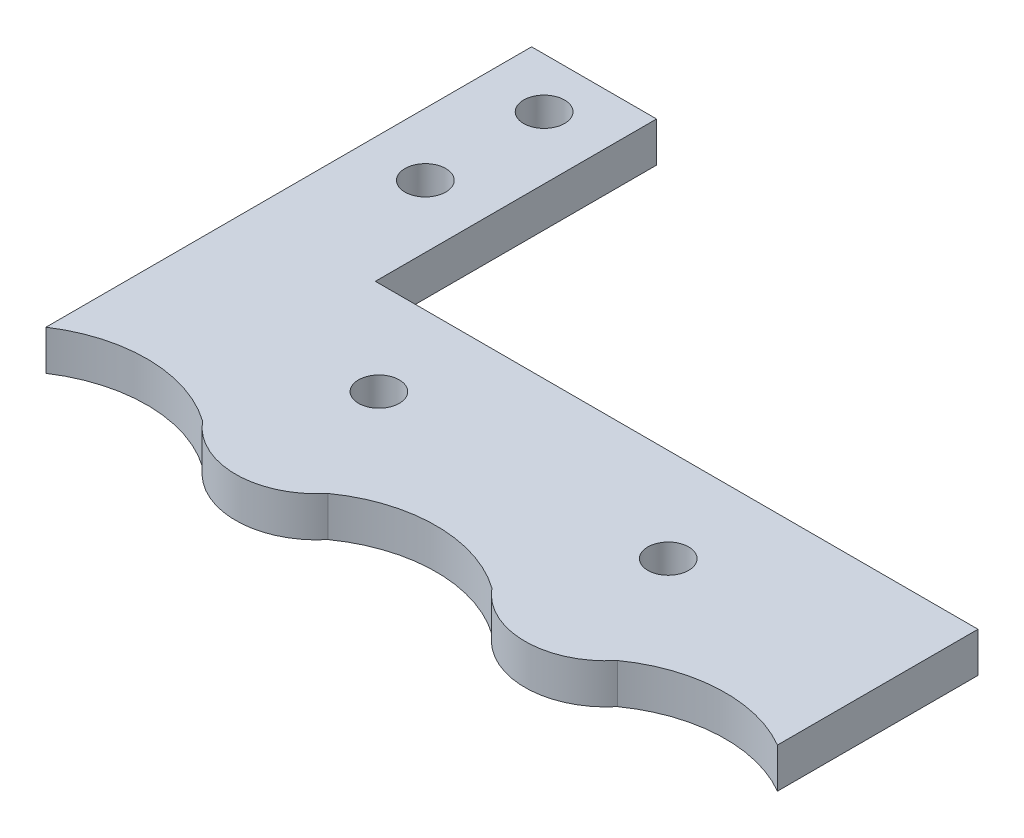
ISO-10303-21;
HEADER;
FILE_DESCRIPTION(('STEP AP214'),'2;1');
FILE_NAME('part.step','',(''),(''),'','','');
FILE_SCHEMA(('AUTOMOTIVE_DESIGN { 1 0 10303 214 1 1 1 1 }'));
ENDSEC;
DATA;
#1=APPLICATION_CONTEXT('core data for automotive mechanical design processes');
#2=APPLICATION_PROTOCOL_DEFINITION('international standard','automotive_design',2000,#1);
#3=PRODUCT_CONTEXT('',#1,'mechanical');
#4=PRODUCT('Part','Part','',(#3));
#5=PRODUCT_RELATED_PRODUCT_CATEGORY('part','',(#4));
#6=PRODUCT_DEFINITION_FORMATION('','',#4);
#7=PRODUCT_DEFINITION_CONTEXT('part definition',#1,'design');
#8=PRODUCT_DEFINITION('design','',#6,#7);
#9=PRODUCT_DEFINITION_SHAPE('','',#8);
#10=(LENGTH_UNIT() NAMED_UNIT(*) SI_UNIT(.MILLI.,.METRE.));
#11=(NAMED_UNIT(*) PLANE_ANGLE_UNIT() SI_UNIT($,.RADIAN.));
#12=(NAMED_UNIT(*) SI_UNIT($,.STERADIAN.) SOLID_ANGLE_UNIT());
#13=UNCERTAINTY_MEASURE_WITH_UNIT(LENGTH_MEASURE(1.E-05),#10,'distance_accuracy_value','');
#14=(GEOMETRIC_REPRESENTATION_CONTEXT(3) GLOBAL_UNCERTAINTY_ASSIGNED_CONTEXT((#13)) GLOBAL_UNIT_ASSIGNED_CONTEXT((#10,
#11,#12)) REPRESENTATION_CONTEXT('',''));
#15=CARTESIAN_POINT('',(0.,0.,0.));
#16=DIRECTION('',(0.,0.,1.));
#17=DIRECTION('',(1.,0.,0.));
#18=AXIS2_PLACEMENT_3D('',#15,#16,#17);
#19=CARTESIAN_POINT('',(-23.15,0.,0.));
#20=DIRECTION('',(0.,-1.,0.));
#21=DIRECTION('',(0.,0.,-1.));
#22=AXIS2_PLACEMENT_3D('',#19,#20,#21);
#23=PLANE('',#22);
#24=CARTESIAN_POINT('',(11.575,0.,-18.325));
#25=DIRECTION('',(0.,-1.,0.));
#26=DIRECTION('',(0.,0.,-1.));
#27=AXIS2_PLACEMENT_3D('',#24,#25,#26);
#28=CIRCLE('',#27,1.63195);
#29=CARTESIAN_POINT('',(11.575,0.,-19.95695));
#30=VERTEX_POINT('',#29);
#31=EDGE_CURVE('E181',#30,#30,#28,.F.);
#32=ORIENTED_EDGE('',*,*,#31,.F.);
#33=EDGE_LOOP('',(#32));
#34=FACE_BOUND('',#33,.T.);
#35=CARTESIAN_POINT('',(-24.3589649235001,0.,-44.325));
#36=DIRECTION('',(0.,1.,0.));
#37=DIRECTION('',(0.,0.,1.));
#38=AXIS2_PLACEMENT_3D('',#35,#36,#37);
#39=CIRCLE('',#38,1.635);
#40=CARTESIAN_POINT('',(-24.3589649235001,0.,-42.69));
#41=VERTEX_POINT('',#40);
#42=EDGE_CURVE('E187',#41,#41,#39,.T.);
#43=ORIENTED_EDGE('',*,*,#42,.F.);
#44=EDGE_LOOP('',(#43));
#45=FACE_BOUND('',#44,.T.);
#46=CARTESIAN_POINT('',(-24.3589649235001,0.,-34.825));
#47=DIRECTION('',(0.,1.,0.));
#48=DIRECTION('',(0.,0.,1.));
#49=AXIS2_PLACEMENT_3D('',#46,#47,#48);
#50=CIRCLE('',#49,1.635);
#51=CARTESIAN_POINT('',(-24.3589649235001,0.,-33.19));
#52=VERTEX_POINT('',#51);
#53=EDGE_CURVE('E191',#52,#52,#50,.T.);
#54=ORIENTED_EDGE('',*,*,#53,.F.);
#55=EDGE_LOOP('',(#54));
#56=FACE_BOUND('',#55,.T.);
#57=CARTESIAN_POINT('',(23.15,0.,0.));
#58=DIRECTION('',(0.,-1.,0.));
#59=DIRECTION('',(0.,0.,-1.));
#60=AXIS2_PLACEMENT_3D('',#57,#58,#59);
#61=CIRCLE('',#60,11.325);
#62=CARTESIAN_POINT('',(28.8589649235001,0.,-9.78076400401553));
#63=VERTEX_POINT('',#62);
#64=CARTESIAN_POINT('',(16.5986509739885,0.,-9.23771892511231));
#65=VERTEX_POINT('',#64);
#66=EDGE_CURVE('E230',#63,#65,#61,.F.);
#67=ORIENTED_EDGE('',*,*,#66,.F.);
#68=DIRECTION('',(0.,0.,1.));
#69=VECTOR('',#68,1.);
#70=CARTESIAN_POINT('',(28.8589649235001,0.,-9.78076400401553));
#71=LINE('',#70,#69);
#72=CARTESIAN_POINT('',(28.8589649235001,0.,-25.825));
#73=VERTEX_POINT('',#72);
#74=EDGE_CURVE('E154',#73,#63,#71,.T.);
#75=ORIENTED_EDGE('',*,*,#74,.F.);
#76=DIRECTION('',(-1.,0.,0.));
#77=VECTOR('',#76,1.);
#78=CARTESIAN_POINT('',(-19.3589649235001,0.,-25.825));
#79=LINE('',#78,#77);
#80=CARTESIAN_POINT('',(-19.3589649235001,0.,-25.825));
#81=VERTEX_POINT('',#80);
#82=EDGE_CURVE('E194',#73,#81,#79,.T.);
#83=ORIENTED_EDGE('',*,*,#82,.T.);
#84=DIRECTION('',(0.,0.,-1.));
#85=VECTOR('',#84,1.);
#86=CARTESIAN_POINT('',(-19.3589649235001,0.,-48.325));
#87=LINE('',#86,#85);
#88=CARTESIAN_POINT('',(-19.3589649235001,0.,-48.325));
#89=VERTEX_POINT('',#88);
#90=EDGE_CURVE('E210',#81,#89,#87,.T.);
#91=ORIENTED_EDGE('',*,*,#90,.T.);
#92=DIRECTION('',(-1.,0.,0.));
#93=VECTOR('',#92,1.);
#94=CARTESIAN_POINT('',(-29.3589649235001,0.,-48.325));
#95=LINE('',#94,#93);
#96=CARTESIAN_POINT('',(-29.3589649235001,0.,-48.325));
#97=VERTEX_POINT('',#96);
#98=EDGE_CURVE('E213',#89,#97,#95,.T.);
#99=ORIENTED_EDGE('',*,*,#98,.T.);
#100=DIRECTION('',(0.,0.,1.));
#101=VECTOR('',#100,1.);
#102=CARTESIAN_POINT('',(-29.3589649235001,0.,-8.86732087942835));
#103=LINE('',#102,#101);
#104=CARTESIAN_POINT('',(-29.3589649235001,0.,-9.47123960095752));
#105=VERTEX_POINT('',#104);
#106=EDGE_CURVE('E82',#97,#105,#103,.T.);
#107=ORIENTED_EDGE('',*,*,#106,.T.);
#108=CARTESIAN_POINT('',(-23.15,0.,0.));
#109=DIRECTION('',(0.,-1.,0.));
#110=DIRECTION('',(0.,0.,-1.));
#111=AXIS2_PLACEMENT_3D('',#108,#109,#110);
#112=CIRCLE('',#111,11.325);
#113=CARTESIAN_POINT('',(-16.5986509739885,0.,-9.23771892511232));
#114=VERTEX_POINT('',#113);
#115=EDGE_CURVE('E165',#114,#105,#112,.F.);
#116=ORIENTED_EDGE('',*,*,#115,.F.);
#117=CARTESIAN_POINT('',(-11.575,0.,-13.3623923535845));
#118=DIRECTION('',(0.,-1.,0.));
#119=DIRECTION('',(0.,0.,-1.));
#120=AXIS2_PLACEMENT_3D('',#117,#118,#119);
#121=CIRCLE('',#120,6.5);
#122=CARTESIAN_POINT('',(-6.5513490260115,0.,-9.23771892511231));
#123=VERTEX_POINT('',#122);
#124=EDGE_CURVE('E140',#123,#114,#121,.T.);
#125=ORIENTED_EDGE('',*,*,#124,.F.);
#126=CARTESIAN_POINT('',(0.,0.,0.));
#127=DIRECTION('',(0.,-1.,0.));
#128=DIRECTION('',(0.,0.,-1.));
#129=AXIS2_PLACEMENT_3D('',#126,#127,#128);
#130=CIRCLE('',#129,11.325);
#131=CARTESIAN_POINT('',(6.55134902601148,0.,-9.23771892511233));
#132=VERTEX_POINT('',#131);
#133=EDGE_CURVE('E236',#132,#123,#130,.F.);
#134=ORIENTED_EDGE('',*,*,#133,.F.);
#135=CARTESIAN_POINT('',(11.575,0.,-13.3623923535845));
#136=DIRECTION('',(0.,-1.,0.));
#137=DIRECTION('',(0.,0.,-1.));
#138=AXIS2_PLACEMENT_3D('',#135,#136,#137);
#139=CIRCLE('',#138,6.5);
#140=EDGE_CURVE('E233',#65,#132,#139,.T.);
#141=ORIENTED_EDGE('',*,*,#140,.F.);
#142=EDGE_LOOP('',(#67,#75,#83,#91,#99,#107,#116,#125,#134,#141));
#143=FACE_BOUND('',#142,.T.);
#144=CARTESIAN_POINT('',(-11.575,0.,-18.325));
#145=DIRECTION('',(0.,-1.,0.));
#146=DIRECTION('',(0.,0.,-1.));
#147=AXIS2_PLACEMENT_3D('',#144,#145,#146);
#148=CIRCLE('',#147,1.63195);
#149=CARTESIAN_POINT('',(-11.575,0.,-19.95695));
#150=VERTEX_POINT('',#149);
#151=EDGE_CURVE('E175',#150,#150,#148,.F.);
#152=ORIENTED_EDGE('',*,*,#151,.F.);
#153=EDGE_LOOP('',(#152));
#154=FACE_BOUND('',#153,.T.);
#155=ADVANCED_FACE('F45',(#34,#45,#56,#143,#154),#23,.F.);
#156=CARTESIAN_POINT('',(-29.3589649235001,-3.2,-8.86732087942835));
#157=DIRECTION('',(-1.,0.,0.));
#158=DIRECTION('',(0.,0.,1.));
#159=AXIS2_PLACEMENT_3D('',#156,#157,#158);
#160=PLANE('',#159);
#161=DIRECTION('',(0.,-1.,0.));
#162=VECTOR('',#161,1.);
#163=CARTESIAN_POINT('',(-29.3589649235001,66.7840576637726,-9.47123960095752));
#164=LINE('',#163,#162);
#165=CARTESIAN_POINT('',(-29.3589649235001,-3.19999999999999,-9.47123960095752));
#166=VERTEX_POINT('',#165);
#167=EDGE_CURVE('E59',#105,#166,#164,.T.);
#168=ORIENTED_EDGE('',*,*,#167,.F.);
#169=ORIENTED_EDGE('',*,*,#106,.F.);
#170=DIRECTION('',(0.,1.,0.));
#171=VECTOR('',#170,1.);
#172=CARTESIAN_POINT('',(-29.3589649235001,-3.2,-48.325));
#173=LINE('',#172,#171);
#174=CARTESIAN_POINT('',(-29.3589649235001,-3.2,-48.325));
#175=VERTEX_POINT('',#174);
#176=EDGE_CURVE('E53',#175,#97,#173,.T.);
#177=ORIENTED_EDGE('',*,*,#176,.F.);
#178=DIRECTION('',(0.,0.,1.));
#179=VECTOR('',#178,1.);
#180=CARTESIAN_POINT('',(-29.3589649235001,-3.2,-25.825));
#181=LINE('',#180,#179);
#182=EDGE_CURVE('E206',#175,#166,#181,.T.);
#183=ORIENTED_EDGE('',*,*,#182,.T.);
#184=EDGE_LOOP('',(#168,#169,#177,#183));
#185=FACE_BOUND('',#184,.T.);
#186=ADVANCED_FACE('F241',(#185),#160,.T.);
#187=CARTESIAN_POINT('',(-29.3589649235001,-3.2,-48.325));
#188=DIRECTION('',(0.,0.,-1.));
#189=DIRECTION('',(-1.,0.,0.));
#190=AXIS2_PLACEMENT_3D('',#187,#188,#189);
#191=PLANE('',#190);
#192=ORIENTED_EDGE('',*,*,#98,.F.);
#193=DIRECTION('',(0.,1.,0.));
#194=VECTOR('',#193,1.);
#195=CARTESIAN_POINT('',(-19.3589649235001,-3.2,-48.325));
#196=LINE('',#195,#194);
#197=CARTESIAN_POINT('',(-19.3589649235001,-3.2,-48.325));
#198=VERTEX_POINT('',#197);
#199=EDGE_CURVE('E218',#198,#89,#196,.T.);
#200=ORIENTED_EDGE('',*,*,#199,.F.);
#201=DIRECTION('',(-1.,0.,0.));
#202=VECTOR('',#201,1.);
#203=CARTESIAN_POINT('',(-29.3589649235001,-3.2,-48.325));
#204=LINE('',#203,#202);
#205=EDGE_CURVE('E203',#198,#175,#204,.T.);
#206=ORIENTED_EDGE('',*,*,#205,.T.);
#207=ORIENTED_EDGE('',*,*,#176,.T.);
#208=EDGE_LOOP('',(#192,#200,#206,#207));
#209=FACE_BOUND('',#208,.T.);
#210=ADVANCED_FACE('F244',(#209),#191,.T.);
#211=CARTESIAN_POINT('',(-19.3589649235001,-3.2,-48.325));
#212=DIRECTION('',(1.,0.,0.));
#213=DIRECTION('',(0.,0.,-1.));
#214=AXIS2_PLACEMENT_3D('',#211,#212,#213);
#215=PLANE('',#214);
#216=ORIENTED_EDGE('',*,*,#90,.F.);
#217=DIRECTION('',(0.,1.,0.));
#218=VECTOR('',#217,1.);
#219=CARTESIAN_POINT('',(-19.3589649235001,-3.2,-25.825));
#220=LINE('',#219,#218);
#221=CARTESIAN_POINT('',(-19.3589649235001,-3.2,-25.825));
#222=VERTEX_POINT('',#221);
#223=EDGE_CURVE('E208',#222,#81,#220,.T.);
#224=ORIENTED_EDGE('',*,*,#223,.F.);
#225=DIRECTION('',(0.,0.,-1.));
#226=VECTOR('',#225,1.);
#227=CARTESIAN_POINT('',(-19.3589649235001,-3.2,-48.325));
#228=LINE('',#227,#226);
#229=EDGE_CURVE('E200',#222,#198,#228,.T.);
#230=ORIENTED_EDGE('',*,*,#229,.T.);
#231=ORIENTED_EDGE('',*,*,#199,.T.);
#232=EDGE_LOOP('',(#216,#224,#230,#231));
#233=FACE_BOUND('',#232,.T.);
#234=ADVANCED_FACE('F223',(#233),#215,.T.);
#235=CARTESIAN_POINT('',(-19.3589649235001,-3.2,-25.825));
#236=DIRECTION('',(0.,0.,-1.));
#237=DIRECTION('',(-1.,0.,0.));
#238=AXIS2_PLACEMENT_3D('',#235,#236,#237);
#239=PLANE('',#238);
#240=DIRECTION('',(0.,-1.,0.));
#241=VECTOR('',#240,1.);
#242=CARTESIAN_POINT('',(28.8589649235001,66.7840576637726,-25.825));
#243=LINE('',#242,#241);
#244=CARTESIAN_POINT('',(28.8589649235001,-3.2,-25.825));
#245=VERTEX_POINT('',#244);
#246=EDGE_CURVE('E163',#73,#245,#243,.T.);
#247=ORIENTED_EDGE('',*,*,#246,.T.);
#248=DIRECTION('',(-1.,0.,0.));
#249=VECTOR('',#248,1.);
#250=CARTESIAN_POINT('',(-19.3589649235001,-3.2,-25.825));
#251=LINE('',#250,#249);
#252=EDGE_CURVE('E88',#245,#222,#251,.T.);
#253=ORIENTED_EDGE('',*,*,#252,.T.);
#254=ORIENTED_EDGE('',*,*,#223,.T.);
#255=ORIENTED_EDGE('',*,*,#82,.F.);
#256=EDGE_LOOP('',(#247,#253,#254,#255));
#257=FACE_BOUND('',#256,.T.);
#258=ADVANCED_FACE('F47',(#257),#239,.T.);
#259=CARTESIAN_POINT('',(-23.15,-3.2,0.));
#260=DIRECTION('',(0.,-1.,0.));
#261=DIRECTION('',(0.,0.,-1.));
#262=AXIS2_PLACEMENT_3D('',#259,#260,#261);
#263=PLANE('',#262);
#264=DIRECTION('',(0.,0.,-1.));
#265=VECTOR('',#264,1.);
#266=CARTESIAN_POINT('',(28.8589649235001,-3.2,-9.78076400401553));
#267=LINE('',#266,#265);
#268=CARTESIAN_POINT('',(28.8589649235001,-3.2,-9.78076400401553));
#269=VERTEX_POINT('',#268);
#270=EDGE_CURVE('E142',#269,#245,#267,.T.);
#271=ORIENTED_EDGE('',*,*,#270,.F.);
#272=CARTESIAN_POINT('',(23.15,-3.2,0.));
#273=DIRECTION('',(0.,-1.,0.));
#274=DIRECTION('',(0.,0.,-1.));
#275=AXIS2_PLACEMENT_3D('',#272,#273,#274);
#276=CIRCLE('',#275,11.325);
#277=CARTESIAN_POINT('',(16.5986509739885,-3.2,-9.23771892511231));
#278=VERTEX_POINT('',#277);
#279=EDGE_CURVE('E159',#278,#269,#276,.T.);
#280=ORIENTED_EDGE('',*,*,#279,.F.);
#281=CARTESIAN_POINT('',(11.575,-3.2,-13.3623923535845));
#282=DIRECTION('',(0.,1.,0.));
#283=DIRECTION('',(0.,0.,-1.));
#284=AXIS2_PLACEMENT_3D('',#281,#282,#283);
#285=CIRCLE('',#284,6.5);
#286=CARTESIAN_POINT('',(6.55134902601148,-3.2,-9.23771892511233));
#287=VERTEX_POINT('',#286);
#288=EDGE_CURVE('E151',#287,#278,#285,.T.);
#289=ORIENTED_EDGE('',*,*,#288,.F.);
#290=CARTESIAN_POINT('',(0.,-3.2,0.));
#291=DIRECTION('',(0.,-1.,0.));
#292=DIRECTION('',(0.,0.,-1.));
#293=AXIS2_PLACEMENT_3D('',#290,#291,#292);
#294=CIRCLE('',#293,11.325);
#295=CARTESIAN_POINT('',(-6.5513490260115,-3.2,-9.23771892511231));
#296=VERTEX_POINT('',#295);
#297=EDGE_CURVE('E149',#296,#287,#294,.T.);
#298=ORIENTED_EDGE('',*,*,#297,.F.);
#299=CARTESIAN_POINT('',(-11.575,-3.2,-13.3623923535845));
#300=DIRECTION('',(0.,1.,0.));
#301=DIRECTION('',(0.,0.,-1.));
#302=AXIS2_PLACEMENT_3D('',#299,#300,#301);
#303=CIRCLE('',#302,6.5);
#304=CARTESIAN_POINT('',(-16.5986509739885,-3.2,-9.23771892511232));
#305=VERTEX_POINT('',#304);
#306=EDGE_CURVE('E137',#305,#296,#303,.T.);
#307=ORIENTED_EDGE('',*,*,#306,.F.);
#308=CARTESIAN_POINT('',(-23.15,-3.19999999999999,0.));
#309=DIRECTION('',(0.,-1.,0.));
#310=DIRECTION('',(0.,0.,-1.));
#311=AXIS2_PLACEMENT_3D('',#308,#309,#310);
#312=CIRCLE('',#311,11.325);
#313=EDGE_CURVE('E11',#166,#305,#312,.T.);
#314=ORIENTED_EDGE('',*,*,#313,.F.);
#315=ORIENTED_EDGE('',*,*,#182,.F.);
#316=ORIENTED_EDGE('',*,*,#205,.F.);
#317=ORIENTED_EDGE('',*,*,#229,.F.);
#318=ORIENTED_EDGE('',*,*,#252,.F.);
#319=EDGE_LOOP('',(#271,#280,#289,#298,#307,#314,#315,#316,#317,#318));
#320=FACE_BOUND('',#319,.T.);
#321=CARTESIAN_POINT('',(-11.575,-3.2,-18.325));
#322=DIRECTION('',(0.,-1.,0.));
#323=DIRECTION('',(0.,0.,-1.));
#324=AXIS2_PLACEMENT_3D('',#321,#322,#323);
#325=CIRCLE('',#324,1.63195);
#326=CARTESIAN_POINT('',(-11.575,-3.2,-19.95695));
#327=VERTEX_POINT('',#326);
#328=EDGE_CURVE('E174',#327,#327,#325,.T.);
#329=ORIENTED_EDGE('',*,*,#328,.F.);
#330=EDGE_LOOP('',(#329));
#331=FACE_BOUND('',#330,.T.);
#332=CARTESIAN_POINT('',(11.575,-3.2,-18.325));
#333=DIRECTION('',(0.,-1.,0.));
#334=DIRECTION('',(0.,0.,-1.));
#335=AXIS2_PLACEMENT_3D('',#332,#333,#334);
#336=CIRCLE('',#335,1.63195);
#337=CARTESIAN_POINT('',(11.575,-3.2,-19.95695));
#338=VERTEX_POINT('',#337);
#339=EDGE_CURVE('E178',#338,#338,#336,.T.);
#340=ORIENTED_EDGE('',*,*,#339,.F.);
#341=EDGE_LOOP('',(#340));
#342=FACE_BOUND('',#341,.T.);
#343=CARTESIAN_POINT('',(-24.3589649235001,-3.2,-44.325));
#344=DIRECTION('',(0.,-1.,0.));
#345=DIRECTION('',(0.,0.,-1.));
#346=AXIS2_PLACEMENT_3D('',#343,#344,#345);
#347=CIRCLE('',#346,1.635);
#348=CARTESIAN_POINT('',(-24.3589649235001,-3.2,-45.96));
#349=VERTEX_POINT('',#348);
#350=EDGE_CURVE('E190',#349,#349,#347,.F.);
#351=ORIENTED_EDGE('',*,*,#350,.T.);
#352=EDGE_LOOP('',(#351));
#353=FACE_BOUND('',#352,.T.);
#354=CARTESIAN_POINT('',(-24.3589649235001,-3.2,-34.825));
#355=DIRECTION('',(0.,-1.,0.));
#356=DIRECTION('',(0.,0.,-1.));
#357=AXIS2_PLACEMENT_3D('',#354,#355,#356);
#358=CIRCLE('',#357,1.635);
#359=CARTESIAN_POINT('',(-24.3589649235001,-3.2,-36.46));
#360=VERTEX_POINT('',#359);
#361=EDGE_CURVE('E184',#360,#360,#358,.F.);
#362=ORIENTED_EDGE('',*,*,#361,.T.);
#363=EDGE_LOOP('',(#362));
#364=FACE_BOUND('',#363,.T.);
#365=ADVANCED_FACE('F145',(#320,#331,#342,#353,#364),#263,.T.);
#366=CARTESIAN_POINT('',(-24.3589649235001,-7.82447834896003,-34.825));
#367=DIRECTION('',(0.,1.,0.));
#368=DIRECTION('',(0.,0.,1.));
#369=AXIS2_PLACEMENT_3D('',#366,#367,#368);
#370=CYLINDRICAL_SURFACE('',#369,1.635);
#371=ORIENTED_EDGE('',*,*,#53,.T.);
#372=EDGE_LOOP('',(#371));
#373=FACE_BOUND('',#372,.T.);
#374=ORIENTED_EDGE('',*,*,#361,.F.);
#375=EDGE_LOOP('',(#374));
#376=FACE_BOUND('',#375,.T.);
#377=ADVANCED_FACE('F263',(#373,#376),#370,.F.);
#378=CARTESIAN_POINT('',(-24.3589649235001,-7.82447834896003,-44.325));
#379=DIRECTION('',(0.,1.,0.));
#380=DIRECTION('',(0.,0.,1.));
#381=AXIS2_PLACEMENT_3D('',#378,#379,#380);
#382=CYLINDRICAL_SURFACE('',#381,1.635);
#383=ORIENTED_EDGE('',*,*,#42,.T.);
#384=EDGE_LOOP('',(#383));
#385=FACE_BOUND('',#384,.T.);
#386=ORIENTED_EDGE('',*,*,#350,.F.);
#387=EDGE_LOOP('',(#386));
#388=FACE_BOUND('',#387,.T.);
#389=ADVANCED_FACE('F266',(#385,#388),#382,.F.);
#390=CARTESIAN_POINT('',(11.575,-3.2,-18.325));
#391=DIRECTION('',(0.,-1.,0.));
#392=DIRECTION('',(0.,0.,-1.));
#393=AXIS2_PLACEMENT_3D('',#390,#391,#392);
#394=CYLINDRICAL_SURFACE('',#393,1.63195);
#395=ORIENTED_EDGE('',*,*,#31,.T.);
#396=EDGE_LOOP('',(#395));
#397=FACE_BOUND('',#396,.T.);
#398=ORIENTED_EDGE('',*,*,#339,.T.);
#399=EDGE_LOOP('',(#398));
#400=FACE_BOUND('',#399,.T.);
#401=ADVANCED_FACE('F270',(#397,#400),#394,.F.);
#402=CARTESIAN_POINT('',(-11.575,-3.2,-18.325));
#403=DIRECTION('',(0.,-1.,0.));
#404=DIRECTION('',(0.,0.,-1.));
#405=AXIS2_PLACEMENT_3D('',#402,#403,#404);
#406=CYLINDRICAL_SURFACE('',#405,1.63195);
#407=ORIENTED_EDGE('',*,*,#151,.T.);
#408=EDGE_LOOP('',(#407));
#409=FACE_BOUND('',#408,.T.);
#410=ORIENTED_EDGE('',*,*,#328,.T.);
#411=EDGE_LOOP('',(#410));
#412=FACE_BOUND('',#411,.T.);
#413=ADVANCED_FACE('F274',(#409,#412),#406,.F.);
#414=CARTESIAN_POINT('',(28.8589649235001,66.7840576637726,-9.78076400401553));
#415=DIRECTION('',(-1.,0.,0.));
#416=DIRECTION('',(0.,0.,1.));
#417=AXIS2_PLACEMENT_3D('',#414,#415,#416);
#418=PLANE('',#417);
#419=ORIENTED_EDGE('',*,*,#74,.T.);
#420=DIRECTION('',(0.,-1.,0.));
#421=VECTOR('',#420,1.);
#422=CARTESIAN_POINT('',(28.8589649235001,66.7840576637726,-9.78076400401553));
#423=LINE('',#422,#421);
#424=EDGE_CURVE('E166',#63,#269,#423,.T.);
#425=ORIENTED_EDGE('',*,*,#424,.T.);
#426=ORIENTED_EDGE('',*,*,#270,.T.);
#427=ORIENTED_EDGE('',*,*,#246,.F.);
#428=EDGE_LOOP('',(#419,#425,#426,#427));
#429=FACE_BOUND('',#428,.T.);
#430=ADVANCED_FACE('F277',(#429),#418,.F.);
#431=CARTESIAN_POINT('',(23.15,66.7840576637726,0.));
#432=DIRECTION('',(0.,-1.,0.));
#433=DIRECTION('',(0.,0.,-1.));
#434=AXIS2_PLACEMENT_3D('',#431,#432,#433);
#435=CYLINDRICAL_SURFACE('',#434,11.325);
#436=ORIENTED_EDGE('',*,*,#66,.T.);
#437=DIRECTION('',(0.,-1.,0.));
#438=VECTOR('',#437,1.);
#439=CARTESIAN_POINT('',(16.5986509739885,66.7840576637726,-9.23771892511231));
#440=LINE('',#439,#438);
#441=EDGE_CURVE('E168',#65,#278,#440,.T.);
#442=ORIENTED_EDGE('',*,*,#441,.T.);
#443=ORIENTED_EDGE('',*,*,#279,.T.);
#444=ORIENTED_EDGE('',*,*,#424,.F.);
#445=EDGE_LOOP('',(#436,#442,#443,#444));
#446=FACE_BOUND('',#445,.T.);
#447=ADVANCED_FACE('F290',(#446),#435,.F.);
#448=CARTESIAN_POINT('',(11.575,66.7840576637726,-13.3623923535845));
#449=DIRECTION('',(0.,-1.,0.));
#450=DIRECTION('',(0.,0.,-1.));
#451=AXIS2_PLACEMENT_3D('',#448,#449,#450);
#452=CYLINDRICAL_SURFACE('',#451,6.5);
#453=ORIENTED_EDGE('',*,*,#140,.T.);
#454=DIRECTION('',(0.,-1.,0.));
#455=VECTOR('',#454,1.);
#456=CARTESIAN_POINT('',(6.55134902601148,66.7840576637726,-9.23771892511233));
#457=LINE('',#456,#455);
#458=EDGE_CURVE('E170',#132,#287,#457,.T.);
#459=ORIENTED_EDGE('',*,*,#458,.T.);
#460=ORIENTED_EDGE('',*,*,#288,.T.);
#461=ORIENTED_EDGE('',*,*,#441,.F.);
#462=EDGE_LOOP('',(#453,#459,#460,#461));
#463=FACE_BOUND('',#462,.T.);
#464=ADVANCED_FACE('F286',(#463),#452,.T.);
#465=CARTESIAN_POINT('',(0.,66.7840576637726,0.));
#466=DIRECTION('',(0.,-1.,0.));
#467=DIRECTION('',(0.,0.,-1.));
#468=AXIS2_PLACEMENT_3D('',#465,#466,#467);
#469=CYLINDRICAL_SURFACE('',#468,11.325);
#470=ORIENTED_EDGE('',*,*,#133,.T.);
#471=DIRECTION('',(0.,-1.,0.));
#472=VECTOR('',#471,1.);
#473=CARTESIAN_POINT('',(-6.5513490260115,66.7840576637726,-9.23771892511231));
#474=LINE('',#473,#472);
#475=EDGE_CURVE('E141',#123,#296,#474,.T.);
#476=ORIENTED_EDGE('',*,*,#475,.T.);
#477=ORIENTED_EDGE('',*,*,#297,.T.);
#478=ORIENTED_EDGE('',*,*,#458,.F.);
#479=EDGE_LOOP('',(#470,#476,#477,#478));
#480=FACE_BOUND('',#479,.T.);
#481=ADVANCED_FACE('F283',(#480),#469,.F.);
#482=CARTESIAN_POINT('',(-11.575,66.7840576637726,-13.3623923535845));
#483=DIRECTION('',(0.,-1.,0.));
#484=DIRECTION('',(0.,0.,-1.));
#485=AXIS2_PLACEMENT_3D('',#482,#483,#484);
#486=CYLINDRICAL_SURFACE('',#485,6.5);
#487=ORIENTED_EDGE('',*,*,#124,.T.);
#488=DIRECTION('',(0.,-1.,0.));
#489=VECTOR('',#488,1.);
#490=CARTESIAN_POINT('',(-16.5986509739885,66.7840576637726,-9.23771892511232));
#491=LINE('',#490,#489);
#492=EDGE_CURVE('E129',#114,#305,#491,.T.);
#493=ORIENTED_EDGE('',*,*,#492,.T.);
#494=ORIENTED_EDGE('',*,*,#306,.T.);
#495=ORIENTED_EDGE('',*,*,#475,.F.);
#496=EDGE_LOOP('',(#487,#493,#494,#495));
#497=FACE_BOUND('',#496,.T.);
#498=ADVANCED_FACE('F135',(#497),#486,.T.);
#499=CARTESIAN_POINT('',(-23.15,66.7840576637726,0.));
#500=DIRECTION('',(0.,-1.,0.));
#501=DIRECTION('',(0.,0.,-1.));
#502=AXIS2_PLACEMENT_3D('',#499,#500,#501);
#503=CYLINDRICAL_SURFACE('',#502,11.325);
#504=ORIENTED_EDGE('',*,*,#167,.T.);
#505=ORIENTED_EDGE('',*,*,#313,.T.);
#506=ORIENTED_EDGE('',*,*,#492,.F.);
#507=ORIENTED_EDGE('',*,*,#115,.T.);
#508=EDGE_LOOP('',(#504,#505,#506,#507));
#509=FACE_BOUND('',#508,.T.);
#510=ADVANCED_FACE('F128',(#509),#503,.F.);
#511=CLOSED_SHELL('',(#155,#186,#210,#234,#258,#365,#377,#389,#401,#413,#430,#447,#464,#481,
#498,#510));
#512=MANIFOLD_SOLID_BREP('B2',#511);
#513=ADVANCED_BREP_SHAPE_REPRESENTATION('',(#18,#512),#14);
#514=SHAPE_DEFINITION_REPRESENTATION(#9,#513);
ENDSEC;
END-ISO-10303-21;
